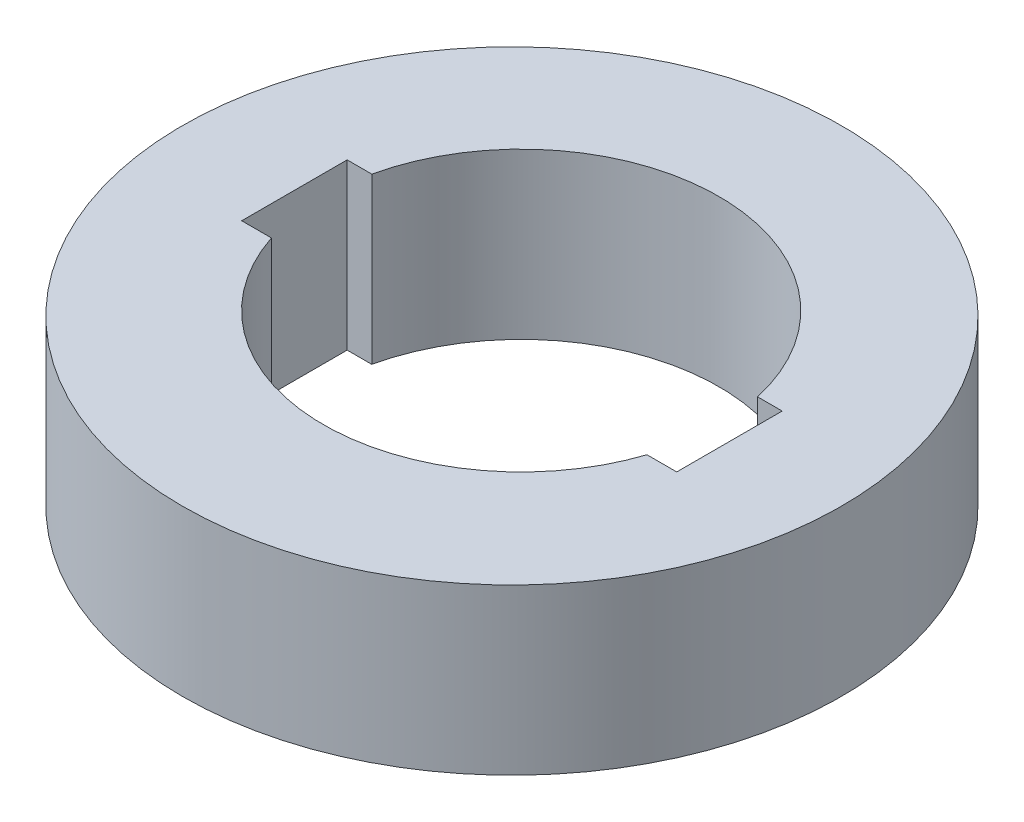
ISO-10303-21;
HEADER;
FILE_DESCRIPTION(('STEP AP214'),'2;1');
FILE_NAME('part.step','',(''),(''),'','','');
FILE_SCHEMA(('AUTOMOTIVE_DESIGN { 1 0 10303 214 1 1 1 1 }'));
ENDSEC;
DATA;
#1=APPLICATION_CONTEXT('core data for automotive mechanical design processes');
#2=APPLICATION_PROTOCOL_DEFINITION('international standard','automotive_design',2000,#1);
#3=PRODUCT_CONTEXT('',#1,'mechanical');
#4=PRODUCT('Part','Part','',(#3));
#5=PRODUCT_RELATED_PRODUCT_CATEGORY('part','',(#4));
#6=PRODUCT_DEFINITION_FORMATION('','',#4);
#7=PRODUCT_DEFINITION_CONTEXT('part definition',#1,'design');
#8=PRODUCT_DEFINITION('design','',#6,#7);
#9=PRODUCT_DEFINITION_SHAPE('','',#8);
#10=(LENGTH_UNIT() NAMED_UNIT(*) SI_UNIT(.MILLI.,.METRE.));
#11=(NAMED_UNIT(*) PLANE_ANGLE_UNIT() SI_UNIT($,.RADIAN.));
#12=(NAMED_UNIT(*) SI_UNIT($,.STERADIAN.) SOLID_ANGLE_UNIT());
#13=UNCERTAINTY_MEASURE_WITH_UNIT(LENGTH_MEASURE(1.E-05),#10,'distance_accuracy_value','');
#14=(GEOMETRIC_REPRESENTATION_CONTEXT(3) GLOBAL_UNCERTAINTY_ASSIGNED_CONTEXT((#13)) GLOBAL_UNIT_ASSIGNED_CONTEXT((#10,
#11,#12)) REPRESENTATION_CONTEXT('',''));
#15=CARTESIAN_POINT('',(0.,0.,0.));
#16=DIRECTION('',(0.,0.,1.));
#17=DIRECTION('',(1.,0.,0.));
#18=AXIS2_PLACEMENT_3D('',#15,#16,#17);
#19=CARTESIAN_POINT('',(0.,-25.,0.));
#20=DIRECTION('',(0.,1.,0.));
#21=DIRECTION('',(0.,0.,1.));
#22=AXIS2_PLACEMENT_3D('',#19,#20,#21);
#23=CYLINDRICAL_SURFACE('',#22,50.);
#24=CARTESIAN_POINT('',(0.,-25.,0.));
#25=DIRECTION('',(0.,1.,0.));
#26=DIRECTION('',(0.,0.,1.));
#27=AXIS2_PLACEMENT_3D('',#24,#25,#26);
#28=CIRCLE('',#27,50.);
#29=CARTESIAN_POINT('',(0.,-25.,50.));
#30=VERTEX_POINT('',#29);
#31=EDGE_CURVE('E11',#30,#30,#28,.T.);
#32=ORIENTED_EDGE('',*,*,#31,.T.);
#33=EDGE_LOOP('',(#32));
#34=FACE_BOUND('',#33,.T.);
#35=CARTESIAN_POINT('',(0.,0.,0.));
#36=DIRECTION('',(0.,1.,0.));
#37=DIRECTION('',(0.,0.,1.));
#38=AXIS2_PLACEMENT_3D('',#35,#36,#37);
#39=CIRCLE('',#38,50.);
#40=CARTESIAN_POINT('',(0.,0.,50.));
#41=VERTEX_POINT('',#40);
#42=EDGE_CURVE('E48',#41,#41,#39,.T.);
#43=ORIENTED_EDGE('',*,*,#42,.F.);
#44=EDGE_LOOP('',(#43));
#45=FACE_BOUND('',#44,.T.);
#46=ADVANCED_FACE('F45',(#34,#45),#23,.T.);
#47=CARTESIAN_POINT('',(0.,-25.,0.));
#48=DIRECTION('',(0.,1.,0.));
#49=DIRECTION('',(0.,0.,1.));
#50=AXIS2_PLACEMENT_3D('',#47,#48,#49);
#51=PLANE('',#50);
#52=DIRECTION('',(-1.,0.,0.));
#53=VECTOR('',#52,1.);
#54=CARTESIAN_POINT('',(-33.,-25.,-8.00000000000001));
#55=LINE('',#54,#53);
#56=CARTESIAN_POINT('',(-29.2659642080708,-25.,-8.));
#57=VERTEX_POINT('',#56);
#58=CARTESIAN_POINT('',(-33.,-25.,-8.00000000000001));
#59=VERTEX_POINT('',#58);
#60=EDGE_CURVE('E118',#57,#59,#55,.T.);
#61=ORIENTED_EDGE('',*,*,#60,.T.);
#62=DIRECTION('',(0.,0.,1.));
#63=VECTOR('',#62,1.);
#64=CARTESIAN_POINT('',(-33.,-25.,0.));
#65=LINE('',#64,#63);
#66=CARTESIAN_POINT('',(-33.,-25.,7.99999999999999));
#67=VERTEX_POINT('',#66);
#68=EDGE_CURVE('E111',#59,#67,#65,.T.);
#69=ORIENTED_EDGE('',*,*,#68,.T.);
#70=DIRECTION('',(1.,0.,0.));
#71=VECTOR('',#70,1.);
#72=CARTESIAN_POINT('',(-33.,-25.,7.99999999999999));
#73=LINE('',#72,#71);
#74=CARTESIAN_POINT('',(-28.4878791113496,-25.,7.99999999999999));
#75=VERTEX_POINT('',#74);
#76=EDGE_CURVE('E121',#67,#75,#73,.T.);
#77=ORIENTED_EDGE('',*,*,#76,.T.);
#78=CARTESIAN_POINT('',(0.,-25.,-1.4042938989129));
#79=DIRECTION('',(0.,1.,0.));
#80=DIRECTION('',(0.,0.,1.));
#81=AXIS2_PLACEMENT_3D('',#78,#79,#80);
#82=CIRCLE('',#81,30.);
#83=CARTESIAN_POINT('',(28.4878791113496,-25.,8.));
#84=VERTEX_POINT('',#83);
#85=EDGE_CURVE('E60',#75,#84,#82,.T.);
#86=ORIENTED_EDGE('',*,*,#85,.T.);
#87=DIRECTION('',(1.,0.,0.));
#88=VECTOR('',#87,1.);
#89=CARTESIAN_POINT('',(33.,-25.,7.99999999999999));
#90=LINE('',#89,#88);
#91=CARTESIAN_POINT('',(33.,-25.,7.99999999999999));
#92=VERTEX_POINT('',#91);
#93=EDGE_CURVE('E139',#84,#92,#90,.T.);
#94=ORIENTED_EDGE('',*,*,#93,.T.);
#95=DIRECTION('',(0.,0.,-1.));
#96=VECTOR('',#95,1.);
#97=CARTESIAN_POINT('',(33.,-25.,0.));
#98=LINE('',#97,#96);
#99=CARTESIAN_POINT('',(33.,-25.,-8.00000000000001));
#100=VERTEX_POINT('',#99);
#101=EDGE_CURVE('E143',#92,#100,#98,.T.);
#102=ORIENTED_EDGE('',*,*,#101,.T.);
#103=DIRECTION('',(-1.,0.,0.));
#104=VECTOR('',#103,1.);
#105=CARTESIAN_POINT('',(33.,-25.,-8.00000000000001));
#106=LINE('',#105,#104);
#107=CARTESIAN_POINT('',(29.2659642080708,-25.,-8.00000000000001));
#108=VERTEX_POINT('',#107);
#109=EDGE_CURVE('E147',#100,#108,#106,.T.);
#110=ORIENTED_EDGE('',*,*,#109,.T.);
#111=CARTESIAN_POINT('',(0.,-25.,-1.4042938989129));
#112=DIRECTION('',(0.,1.,0.));
#113=DIRECTION('',(0.,0.,1.));
#114=AXIS2_PLACEMENT_3D('',#111,#112,#113);
#115=CIRCLE('',#114,30.);
#116=EDGE_CURVE('E151',#108,#57,#115,.T.);
#117=ORIENTED_EDGE('',*,*,#116,.T.);
#118=EDGE_LOOP('',(#61,#69,#77,#86,#94,#102,#110,#117));
#119=FACE_BOUND('',#118,.T.);
#120=ORIENTED_EDGE('',*,*,#31,.F.);
#121=EDGE_LOOP('',(#120));
#122=FACE_BOUND('',#121,.T.);
#123=ADVANCED_FACE('F127',(#119,#122),#51,.F.);
#124=CARTESIAN_POINT('',(0.,0.,0.));
#125=DIRECTION('',(0.,1.,0.));
#126=DIRECTION('',(0.,0.,1.));
#127=AXIS2_PLACEMENT_3D('',#124,#125,#126);
#128=PLANE('',#127);
#129=DIRECTION('',(0.,0.,1.));
#130=VECTOR('',#129,1.);
#131=CARTESIAN_POINT('',(-33.,0.,0.));
#132=LINE('',#131,#130);
#133=CARTESIAN_POINT('',(-33.,0.,-8.00000000000001));
#134=VERTEX_POINT('',#133);
#135=CARTESIAN_POINT('',(-33.,0.,7.99999999999999));
#136=VERTEX_POINT('',#135);
#137=EDGE_CURVE('E114',#134,#136,#132,.T.);
#138=ORIENTED_EDGE('',*,*,#137,.F.);
#139=DIRECTION('',(-1.,0.,0.));
#140=VECTOR('',#139,1.);
#141=CARTESIAN_POINT('',(-33.,0.,-8.00000000000001));
#142=LINE('',#141,#140);
#143=CARTESIAN_POINT('',(-29.2659642080708,0.,-8.));
#144=VERTEX_POINT('',#143);
#145=EDGE_CURVE('E134',#144,#134,#142,.T.);
#146=ORIENTED_EDGE('',*,*,#145,.F.);
#147=CARTESIAN_POINT('',(0.,0.,-1.4042938989129));
#148=DIRECTION('',(0.,1.,0.));
#149=DIRECTION('',(0.,0.,1.));
#150=AXIS2_PLACEMENT_3D('',#147,#148,#149);
#151=CIRCLE('',#150,30.);
#152=CARTESIAN_POINT('',(29.2659642080708,0.,-8.00000000000001));
#153=VERTEX_POINT('',#152);
#154=EDGE_CURVE('E175',#153,#144,#151,.T.);
#155=ORIENTED_EDGE('',*,*,#154,.F.);
#156=DIRECTION('',(-1.,0.,0.));
#157=VECTOR('',#156,1.);
#158=CARTESIAN_POINT('',(33.,0.,-8.00000000000001));
#159=LINE('',#158,#157);
#160=CARTESIAN_POINT('',(33.,0.,-8.00000000000001));
#161=VERTEX_POINT('',#160);
#162=EDGE_CURVE('E171',#161,#153,#159,.T.);
#163=ORIENTED_EDGE('',*,*,#162,.F.);
#164=DIRECTION('',(0.,0.,-1.));
#165=VECTOR('',#164,1.);
#166=CARTESIAN_POINT('',(33.,0.,0.));
#167=LINE('',#166,#165);
#168=CARTESIAN_POINT('',(33.,0.,7.99999999999999));
#169=VERTEX_POINT('',#168);
#170=EDGE_CURVE('E167',#169,#161,#167,.T.);
#171=ORIENTED_EDGE('',*,*,#170,.F.);
#172=DIRECTION('',(1.,0.,0.));
#173=VECTOR('',#172,1.);
#174=CARTESIAN_POINT('',(33.,0.,7.99999999999999));
#175=LINE('',#174,#173);
#176=CARTESIAN_POINT('',(28.4878791113496,0.,8.));
#177=VERTEX_POINT('',#176);
#178=EDGE_CURVE('E163',#177,#169,#175,.T.);
#179=ORIENTED_EDGE('',*,*,#178,.F.);
#180=CARTESIAN_POINT('',(0.,0.,-1.4042938989129));
#181=DIRECTION('',(0.,1.,0.));
#182=DIRECTION('',(0.,0.,1.));
#183=AXIS2_PLACEMENT_3D('',#180,#181,#182);
#184=CIRCLE('',#183,30.);
#185=CARTESIAN_POINT('',(-28.4878791113496,0.,7.99999999999999));
#186=VERTEX_POINT('',#185);
#187=EDGE_CURVE('E159',#186,#177,#184,.T.);
#188=ORIENTED_EDGE('',*,*,#187,.F.);
#189=DIRECTION('',(1.,0.,0.));
#190=VECTOR('',#189,1.);
#191=CARTESIAN_POINT('',(-33.,0.,7.99999999999999));
#192=LINE('',#191,#190);
#193=EDGE_CURVE('E156',#136,#186,#192,.T.);
#194=ORIENTED_EDGE('',*,*,#193,.F.);
#195=EDGE_LOOP('',(#138,#146,#155,#163,#171,#179,#188,#194));
#196=FACE_BOUND('',#195,.T.);
#197=ORIENTED_EDGE('',*,*,#42,.T.);
#198=EDGE_LOOP('',(#197));
#199=FACE_BOUND('',#198,.T.);
#200=ADVANCED_FACE('F205',(#196,#199),#128,.T.);
#201=CARTESIAN_POINT('',(-33.,-25.,0.));
#202=DIRECTION('',(-1.,0.,0.));
#203=DIRECTION('',(0.,0.,1.));
#204=AXIS2_PLACEMENT_3D('',#201,#202,#203);
#205=PLANE('',#204);
#206=ORIENTED_EDGE('',*,*,#137,.T.);
#207=DIRECTION('',(0.,1.,0.));
#208=VECTOR('',#207,1.);
#209=CARTESIAN_POINT('',(-33.,-25.,7.99999999999999));
#210=LINE('',#209,#208);
#211=EDGE_CURVE('E68',#67,#136,#210,.T.);
#212=ORIENTED_EDGE('',*,*,#211,.F.);
#213=ORIENTED_EDGE('',*,*,#68,.F.);
#214=DIRECTION('',(0.,1.,0.));
#215=VECTOR('',#214,1.);
#216=CARTESIAN_POINT('',(-33.,-25.,-8.00000000000001));
#217=LINE('',#216,#215);
#218=EDGE_CURVE('E182',#59,#134,#217,.T.);
#219=ORIENTED_EDGE('',*,*,#218,.T.);
#220=EDGE_LOOP('',(#206,#212,#213,#219));
#221=FACE_BOUND('',#220,.T.);
#222=ADVANCED_FACE('F109',(#221),#205,.F.);
#223=CARTESIAN_POINT('',(-33.,-25.,-8.00000000000001));
#224=DIRECTION('',(0.,0.,-1.));
#225=DIRECTION('',(-1.,0.,0.));
#226=AXIS2_PLACEMENT_3D('',#223,#224,#225);
#227=PLANE('',#226);
#228=ORIENTED_EDGE('',*,*,#145,.T.);
#229=ORIENTED_EDGE('',*,*,#218,.F.);
#230=ORIENTED_EDGE('',*,*,#60,.F.);
#231=DIRECTION('',(0.,1.,0.));
#232=VECTOR('',#231,1.);
#233=CARTESIAN_POINT('',(-29.2659642080708,-25.,-8.));
#234=LINE('',#233,#232);
#235=EDGE_CURVE('E185',#57,#144,#234,.T.);
#236=ORIENTED_EDGE('',*,*,#235,.T.);
#237=EDGE_LOOP('',(#228,#229,#230,#236));
#238=FACE_BOUND('',#237,.T.);
#239=ADVANCED_FACE('F224',(#238),#227,.F.);
#240=CARTESIAN_POINT('',(0.,-25.,-1.4042938989129));
#241=DIRECTION('',(0.,1.,0.));
#242=DIRECTION('',(0.,0.,1.));
#243=AXIS2_PLACEMENT_3D('',#240,#241,#242);
#244=CYLINDRICAL_SURFACE('',#243,30.);
#245=ORIENTED_EDGE('',*,*,#154,.T.);
#246=ORIENTED_EDGE('',*,*,#235,.F.);
#247=ORIENTED_EDGE('',*,*,#116,.F.);
#248=DIRECTION('',(0.,1.,0.));
#249=VECTOR('',#248,1.);
#250=CARTESIAN_POINT('',(29.2659642080708,-25.,-8.00000000000001));
#251=LINE('',#250,#249);
#252=EDGE_CURVE('E188',#108,#153,#251,.T.);
#253=ORIENTED_EDGE('',*,*,#252,.T.);
#254=EDGE_LOOP('',(#245,#246,#247,#253));
#255=FACE_BOUND('',#254,.T.);
#256=ADVANCED_FACE('F221',(#255),#244,.F.);
#257=CARTESIAN_POINT('',(33.,-25.,-8.00000000000001));
#258=DIRECTION('',(0.,0.,-1.));
#259=DIRECTION('',(-1.,0.,0.));
#260=AXIS2_PLACEMENT_3D('',#257,#258,#259);
#261=PLANE('',#260);
#262=ORIENTED_EDGE('',*,*,#162,.T.);
#263=ORIENTED_EDGE('',*,*,#252,.F.);
#264=ORIENTED_EDGE('',*,*,#109,.F.);
#265=DIRECTION('',(0.,1.,0.));
#266=VECTOR('',#265,1.);
#267=CARTESIAN_POINT('',(33.,-25.,-8.00000000000001));
#268=LINE('',#267,#266);
#269=EDGE_CURVE('E191',#100,#161,#268,.T.);
#270=ORIENTED_EDGE('',*,*,#269,.T.);
#271=EDGE_LOOP('',(#262,#263,#264,#270));
#272=FACE_BOUND('',#271,.T.);
#273=ADVANCED_FACE('F217',(#272),#261,.F.);
#274=CARTESIAN_POINT('',(33.,-25.,0.));
#275=DIRECTION('',(1.,0.,0.));
#276=DIRECTION('',(0.,0.,-1.));
#277=AXIS2_PLACEMENT_3D('',#274,#275,#276);
#278=PLANE('',#277);
#279=ORIENTED_EDGE('',*,*,#170,.T.);
#280=ORIENTED_EDGE('',*,*,#269,.F.);
#281=ORIENTED_EDGE('',*,*,#101,.F.);
#282=DIRECTION('',(0.,1.,0.));
#283=VECTOR('',#282,1.);
#284=CARTESIAN_POINT('',(33.,-25.,7.99999999999999));
#285=LINE('',#284,#283);
#286=EDGE_CURVE('E194',#92,#169,#285,.T.);
#287=ORIENTED_EDGE('',*,*,#286,.T.);
#288=EDGE_LOOP('',(#279,#280,#281,#287));
#289=FACE_BOUND('',#288,.T.);
#290=ADVANCED_FACE('F215',(#289),#278,.F.);
#291=CARTESIAN_POINT('',(33.,-25.,7.99999999999999));
#292=DIRECTION('',(0.,0.,1.));
#293=DIRECTION('',(1.,0.,0.));
#294=AXIS2_PLACEMENT_3D('',#291,#292,#293);
#295=PLANE('',#294);
#296=ORIENTED_EDGE('',*,*,#178,.T.);
#297=ORIENTED_EDGE('',*,*,#286,.F.);
#298=ORIENTED_EDGE('',*,*,#93,.F.);
#299=DIRECTION('',(0.,1.,0.));
#300=VECTOR('',#299,1.);
#301=CARTESIAN_POINT('',(28.4878791113496,-25.,8.));
#302=LINE('',#301,#300);
#303=EDGE_CURVE('E197',#84,#177,#302,.T.);
#304=ORIENTED_EDGE('',*,*,#303,.T.);
#305=EDGE_LOOP('',(#296,#297,#298,#304));
#306=FACE_BOUND('',#305,.T.);
#307=ADVANCED_FACE('F210',(#306),#295,.F.);
#308=CARTESIAN_POINT('',(0.,-25.,-1.4042938989129));
#309=DIRECTION('',(0.,1.,0.));
#310=DIRECTION('',(0.,0.,1.));
#311=AXIS2_PLACEMENT_3D('',#308,#309,#310);
#312=CYLINDRICAL_SURFACE('',#311,30.);
#313=ORIENTED_EDGE('',*,*,#187,.T.);
#314=ORIENTED_EDGE('',*,*,#303,.F.);
#315=ORIENTED_EDGE('',*,*,#85,.F.);
#316=DIRECTION('',(0.,1.,0.));
#317=VECTOR('',#316,1.);
#318=CARTESIAN_POINT('',(-28.4878791113496,-25.,7.99999999999999));
#319=LINE('',#318,#317);
#320=EDGE_CURVE('E117',#75,#186,#319,.T.);
#321=ORIENTED_EDGE('',*,*,#320,.T.);
#322=EDGE_LOOP('',(#313,#314,#315,#321));
#323=FACE_BOUND('',#322,.T.);
#324=ADVANCED_FACE('F201',(#323),#312,.F.);
#325=CARTESIAN_POINT('',(-33.,-25.,7.99999999999999));
#326=DIRECTION('',(0.,0.,1.));
#327=DIRECTION('',(1.,0.,0.));
#328=AXIS2_PLACEMENT_3D('',#325,#326,#327);
#329=PLANE('',#328);
#330=ORIENTED_EDGE('',*,*,#193,.T.);
#331=ORIENTED_EDGE('',*,*,#320,.F.);
#332=ORIENTED_EDGE('',*,*,#76,.F.);
#333=ORIENTED_EDGE('',*,*,#211,.T.);
#334=EDGE_LOOP('',(#330,#331,#332,#333));
#335=FACE_BOUND('',#334,.T.);
#336=ADVANCED_FACE('F122',(#335),#329,.F.);
#337=CLOSED_SHELL('',(#46,#123,#200,#222,#239,#256,#273,#290,#307,#324,#336));
#338=MANIFOLD_SOLID_BREP('B2',#337);
#339=ADVANCED_BREP_SHAPE_REPRESENTATION('',(#18,#338),#14);
#340=SHAPE_DEFINITION_REPRESENTATION(#9,#339);
ENDSEC;
END-ISO-10303-21;
